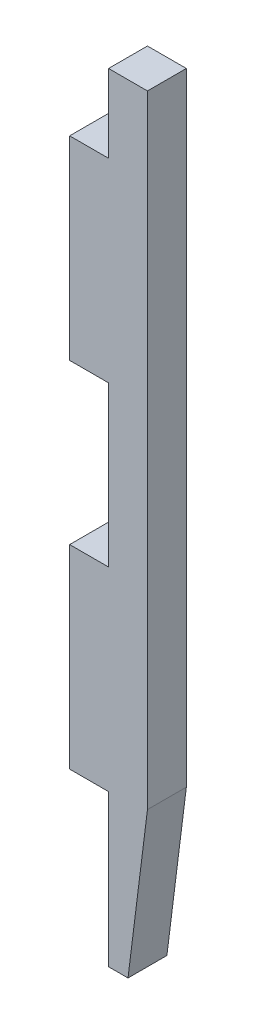
ISO-10303-21;
HEADER;
FILE_DESCRIPTION(('STEP AP214'),'2;1');
FILE_NAME('part.step','',(''),(''),'','','');
FILE_SCHEMA(('AUTOMOTIVE_DESIGN { 1 0 10303 214 1 1 1 1 }'));
ENDSEC;
DATA;
#1=APPLICATION_CONTEXT('core data for automotive mechanical design processes');
#2=APPLICATION_PROTOCOL_DEFINITION('international standard','automotive_design',2000,#1);
#3=PRODUCT_CONTEXT('',#1,'mechanical');
#4=PRODUCT('Part','Part','',(#3));
#5=PRODUCT_RELATED_PRODUCT_CATEGORY('part','',(#4));
#6=PRODUCT_DEFINITION_FORMATION('','',#4);
#7=PRODUCT_DEFINITION_CONTEXT('part definition',#1,'design');
#8=PRODUCT_DEFINITION('design','',#6,#7);
#9=PRODUCT_DEFINITION_SHAPE('','',#8);
#10=(LENGTH_UNIT() NAMED_UNIT(*) SI_UNIT(.MILLI.,.METRE.));
#11=(NAMED_UNIT(*) PLANE_ANGLE_UNIT() SI_UNIT($,.RADIAN.));
#12=(NAMED_UNIT(*) SI_UNIT($,.STERADIAN.) SOLID_ANGLE_UNIT());
#13=UNCERTAINTY_MEASURE_WITH_UNIT(LENGTH_MEASURE(1.E-05),#10,'distance_accuracy_value','');
#14=(GEOMETRIC_REPRESENTATION_CONTEXT(3) GLOBAL_UNCERTAINTY_ASSIGNED_CONTEXT((#13)) GLOBAL_UNIT_ASSIGNED_CONTEXT((#10,
#11,#12)) REPRESENTATION_CONTEXT('',''));
#15=CARTESIAN_POINT('',(0.,0.,0.));
#16=DIRECTION('',(0.,0.,1.));
#17=DIRECTION('',(1.,0.,0.));
#18=AXIS2_PLACEMENT_3D('',#15,#16,#17);
#19=CARTESIAN_POINT('',(0.,19.5,-5.));
#20=DIRECTION('',(1.,0.,0.));
#21=DIRECTION('',(0.,0.,1.));
#22=AXIS2_PLACEMENT_3D('',#19,#20,#21);
#23=PLANE('',#22);
#24=DIRECTION('',(0.,-1.,0.));
#25=VECTOR('',#24,1.);
#26=CARTESIAN_POINT('',(0.,19.5,0.));
#27=LINE('',#26,#25);
#28=CARTESIAN_POINT('',(0.,19.5,0.));
#29=VERTEX_POINT('',#28);
#30=CARTESIAN_POINT('',(0.,0.,0.));
#31=VERTEX_POINT('',#30);
#32=EDGE_CURVE('E161',#29,#31,#27,.T.);
#33=ORIENTED_EDGE('',*,*,#32,.F.);
#34=DIRECTION('',(0.,0.,1.));
#35=VECTOR('',#34,1.);
#36=CARTESIAN_POINT('',(0.,19.5,-5.));
#37=LINE('',#36,#35);
#38=CARTESIAN_POINT('',(0.,19.5,-5.));
#39=VERTEX_POINT('',#38);
#40=EDGE_CURVE('E160',#39,#29,#37,.T.);
#41=ORIENTED_EDGE('',*,*,#40,.F.);
#42=DIRECTION('',(0.,-1.,0.));
#43=VECTOR('',#42,1.);
#44=CARTESIAN_POINT('',(0.,19.5,-5.));
#45=LINE('',#44,#43);
#46=CARTESIAN_POINT('',(0.,0.,-5.));
#47=VERTEX_POINT('',#46);
#48=EDGE_CURVE('E194',#39,#47,#45,.T.);
#49=ORIENTED_EDGE('',*,*,#48,.T.);
#50=DIRECTION('',(0.,0.,1.));
#51=VECTOR('',#50,1.);
#52=CARTESIAN_POINT('',(0.,0.,-5.));
#53=LINE('',#52,#51);
#54=EDGE_CURVE('E11',#47,#31,#53,.T.);
#55=ORIENTED_EDGE('',*,*,#54,.T.);
#56=EDGE_LOOP('',(#33,#41,#49,#55));
#57=FACE_BOUND('',#56,.T.);
#58=ADVANCED_FACE('F35',(#57),#23,.F.);
#59=CARTESIAN_POINT('',(0.,0.,-5.));
#60=DIRECTION('',(0.,1.,0.));
#61=DIRECTION('',(0.,0.,-1.));
#62=AXIS2_PLACEMENT_3D('',#59,#60,#61);
#63=PLANE('',#62);
#64=DIRECTION('',(1.,0.,0.));
#65=VECTOR('',#64,1.);
#66=CARTESIAN_POINT('',(0.,0.,0.));
#67=LINE('',#66,#65);
#68=CARTESIAN_POINT('',(2.5,0.,0.));
#69=VERTEX_POINT('',#68);
#70=EDGE_CURVE('E163',#31,#69,#67,.T.);
#71=ORIENTED_EDGE('',*,*,#70,.F.);
#72=ORIENTED_EDGE('',*,*,#54,.F.);
#73=DIRECTION('',(1.,0.,0.));
#74=VECTOR('',#73,1.);
#75=CARTESIAN_POINT('',(0.,0.,-5.));
#76=LINE('',#75,#74);
#77=CARTESIAN_POINT('',(2.5,0.,-5.));
#78=VERTEX_POINT('',#77);
#79=EDGE_CURVE('E104',#47,#78,#76,.T.);
#80=ORIENTED_EDGE('',*,*,#79,.T.);
#81=DIRECTION('',(0.,0.,1.));
#82=VECTOR('',#81,1.);
#83=CARTESIAN_POINT('',(2.5,0.,-5.));
#84=LINE('',#83,#82);
#85=EDGE_CURVE('E43',#78,#69,#84,.T.);
#86=ORIENTED_EDGE('',*,*,#85,.T.);
#87=EDGE_LOOP('',(#71,#72,#80,#86));
#88=FACE_BOUND('',#87,.T.);
#89=ADVANCED_FACE('F221',(#88),#63,.F.);
#90=CARTESIAN_POINT('',(2.5,0.,-5.));
#91=DIRECTION('',(-0.992277876713668,0.124034734589208,0.));
#92=DIRECTION('',(-0.124034734589208,-0.992277876713668,0.));
#93=AXIS2_PLACEMENT_3D('',#90,#91,#92);
#94=PLANE('',#93);
#95=DIRECTION('',(0.124034734589208,0.992277876713668,0.));
#96=VECTOR('',#95,1.);
#97=CARTESIAN_POINT('',(2.5,0.,0.));
#98=LINE('',#97,#96);
#99=CARTESIAN_POINT('',(5.,20.,0.));
#100=VERTEX_POINT('',#99);
#101=EDGE_CURVE('E166',#69,#100,#98,.T.);
#102=ORIENTED_EDGE('',*,*,#101,.F.);
#103=ORIENTED_EDGE('',*,*,#85,.F.);
#104=DIRECTION('',(0.124034734589208,0.992277876713668,0.));
#105=VECTOR('',#104,1.);
#106=CARTESIAN_POINT('',(2.5,0.,-5.));
#107=LINE('',#106,#105);
#108=CARTESIAN_POINT('',(5.,20.,-5.));
#109=VERTEX_POINT('',#108);
#110=EDGE_CURVE('E230',#78,#109,#107,.T.);
#111=ORIENTED_EDGE('',*,*,#110,.T.);
#112=DIRECTION('',(0.,0.,1.));
#113=VECTOR('',#112,1.);
#114=CARTESIAN_POINT('',(5.,20.,-5.));
#115=LINE('',#114,#113);
#116=EDGE_CURVE('E216',#109,#100,#115,.T.);
#117=ORIENTED_EDGE('',*,*,#116,.T.);
#118=EDGE_LOOP('',(#102,#103,#111,#117));
#119=FACE_BOUND('',#118,.T.);
#120=ADVANCED_FACE('F270',(#119),#94,.F.);
#121=CARTESIAN_POINT('',(5.,20.,-5.));
#122=DIRECTION('',(-1.,0.,0.));
#123=DIRECTION('',(0.,0.,-1.));
#124=AXIS2_PLACEMENT_3D('',#121,#122,#123);
#125=PLANE('',#124);
#126=DIRECTION('',(0.,1.,0.));
#127=VECTOR('',#126,1.);
#128=CARTESIAN_POINT('',(5.,20.,0.));
#129=LINE('',#128,#127);
#130=CARTESIAN_POINT('',(5.,100.,0.));
#131=VERTEX_POINT('',#130);
#132=EDGE_CURVE('E169',#100,#131,#129,.T.);
#133=ORIENTED_EDGE('',*,*,#132,.F.);
#134=ORIENTED_EDGE('',*,*,#116,.F.);
#135=DIRECTION('',(0.,1.,0.));
#136=VECTOR('',#135,1.);
#137=CARTESIAN_POINT('',(5.,20.,-5.));
#138=LINE('',#137,#136);
#139=CARTESIAN_POINT('',(5.,100.,-5.));
#140=VERTEX_POINT('',#139);
#141=EDGE_CURVE('E234',#109,#140,#138,.T.);
#142=ORIENTED_EDGE('',*,*,#141,.T.);
#143=DIRECTION('',(0.,0.,1.));
#144=VECTOR('',#143,1.);
#145=CARTESIAN_POINT('',(5.,100.,-5.));
#146=LINE('',#145,#144);
#147=EDGE_CURVE('E213',#140,#131,#146,.T.);
#148=ORIENTED_EDGE('',*,*,#147,.T.);
#149=EDGE_LOOP('',(#133,#134,#142,#148));
#150=FACE_BOUND('',#149,.T.);
#151=ADVANCED_FACE('F269',(#150),#125,.F.);
#152=CARTESIAN_POINT('',(5.,100.,-5.));
#153=DIRECTION('',(0.,-1.,0.));
#154=DIRECTION('',(0.,0.,1.));
#155=AXIS2_PLACEMENT_3D('',#152,#153,#154);
#156=PLANE('',#155);
#157=DIRECTION('',(-1.,0.,0.));
#158=VECTOR('',#157,1.);
#159=CARTESIAN_POINT('',(5.,100.,0.));
#160=LINE('',#159,#158);
#161=CARTESIAN_POINT('',(0.,100.,0.));
#162=VERTEX_POINT('',#161);
#163=EDGE_CURVE('E172',#131,#162,#160,.T.);
#164=ORIENTED_EDGE('',*,*,#163,.F.);
#165=ORIENTED_EDGE('',*,*,#147,.F.);
#166=DIRECTION('',(-1.,0.,0.));
#167=VECTOR('',#166,1.);
#168=CARTESIAN_POINT('',(5.,100.,-5.));
#169=LINE('',#168,#167);
#170=CARTESIAN_POINT('',(0.,100.,-5.));
#171=VERTEX_POINT('',#170);
#172=EDGE_CURVE('E237',#140,#171,#169,.T.);
#173=ORIENTED_EDGE('',*,*,#172,.T.);
#174=DIRECTION('',(0.,0.,1.));
#175=VECTOR('',#174,1.);
#176=CARTESIAN_POINT('',(0.,100.,-5.));
#177=LINE('',#176,#175);
#178=EDGE_CURVE('E210',#171,#162,#177,.T.);
#179=ORIENTED_EDGE('',*,*,#178,.T.);
#180=EDGE_LOOP('',(#164,#165,#173,#179));
#181=FACE_BOUND('',#180,.T.);
#182=ADVANCED_FACE('F266',(#181),#156,.F.);
#183=CARTESIAN_POINT('',(0.,100.,-5.));
#184=DIRECTION('',(1.,0.,0.));
#185=DIRECTION('',(0.,1.,0.));
#186=AXIS2_PLACEMENT_3D('',#183,#184,#185);
#187=PLANE('',#186);
#188=DIRECTION('',(0.,-1.,0.));
#189=VECTOR('',#188,1.);
#190=CARTESIAN_POINT('',(0.,100.,0.));
#191=LINE('',#190,#189);
#192=CARTESIAN_POINT('',(0.,90.,0.));
#193=VERTEX_POINT('',#192);
#194=EDGE_CURVE('E175',#162,#193,#191,.T.);
#195=ORIENTED_EDGE('',*,*,#194,.F.);
#196=ORIENTED_EDGE('',*,*,#178,.F.);
#197=DIRECTION('',(0.,-1.,0.));
#198=VECTOR('',#197,1.);
#199=CARTESIAN_POINT('',(0.,100.,-5.));
#200=LINE('',#199,#198);
#201=CARTESIAN_POINT('',(0.,90.,-5.));
#202=VERTEX_POINT('',#201);
#203=EDGE_CURVE('E240',#171,#202,#200,.T.);
#204=ORIENTED_EDGE('',*,*,#203,.T.);
#205=DIRECTION('',(0.,0.,1.));
#206=VECTOR('',#205,1.);
#207=CARTESIAN_POINT('',(0.,90.,-5.));
#208=LINE('',#207,#206);
#209=EDGE_CURVE('E207',#202,#193,#208,.T.);
#210=ORIENTED_EDGE('',*,*,#209,.T.);
#211=EDGE_LOOP('',(#195,#196,#204,#210));
#212=FACE_BOUND('',#211,.T.);
#213=ADVANCED_FACE('F264',(#212),#187,.F.);
#214=CARTESIAN_POINT('',(0.,90.,-5.));
#215=DIRECTION('',(0.,-1.,0.));
#216=DIRECTION('',(1.,0.,0.));
#217=AXIS2_PLACEMENT_3D('',#214,#215,#216);
#218=PLANE('',#217);
#219=DIRECTION('',(-1.,0.,0.));
#220=VECTOR('',#219,1.);
#221=CARTESIAN_POINT('',(0.,90.,0.));
#222=LINE('',#221,#220);
#223=CARTESIAN_POINT('',(-5.,90.,0.));
#224=VERTEX_POINT('',#223);
#225=EDGE_CURVE('E178',#193,#224,#222,.T.);
#226=ORIENTED_EDGE('',*,*,#225,.F.);
#227=ORIENTED_EDGE('',*,*,#209,.F.);
#228=DIRECTION('',(-1.,0.,0.));
#229=VECTOR('',#228,1.);
#230=CARTESIAN_POINT('',(0.,90.,-5.));
#231=LINE('',#230,#229);
#232=CARTESIAN_POINT('',(-5.,90.,-5.));
#233=VERTEX_POINT('',#232);
#234=EDGE_CURVE('E243',#202,#233,#231,.T.);
#235=ORIENTED_EDGE('',*,*,#234,.T.);
#236=DIRECTION('',(0.,0.,1.));
#237=VECTOR('',#236,1.);
#238=CARTESIAN_POINT('',(-5.,90.,-5.));
#239=LINE('',#238,#237);
#240=EDGE_CURVE('E204',#233,#224,#239,.T.);
#241=ORIENTED_EDGE('',*,*,#240,.T.);
#242=EDGE_LOOP('',(#226,#227,#235,#241));
#243=FACE_BOUND('',#242,.T.);
#244=ADVANCED_FACE('F260',(#243),#218,.F.);
#245=CARTESIAN_POINT('',(-5.,90.,-5.));
#246=DIRECTION('',(1.,0.,0.));
#247=DIRECTION('',(0.,1.,0.));
#248=AXIS2_PLACEMENT_3D('',#245,#246,#247);
#249=PLANE('',#248);
#250=DIRECTION('',(0.,-1.,0.));
#251=VECTOR('',#250,1.);
#252=CARTESIAN_POINT('',(-5.,90.,0.));
#253=LINE('',#252,#251);
#254=CARTESIAN_POINT('',(-4.99999999999999,65.,0.));
#255=VERTEX_POINT('',#254);
#256=EDGE_CURVE('E181',#224,#255,#253,.T.);
#257=ORIENTED_EDGE('',*,*,#256,.F.);
#258=ORIENTED_EDGE('',*,*,#240,.F.);
#259=DIRECTION('',(0.,-1.,0.));
#260=VECTOR('',#259,1.);
#261=CARTESIAN_POINT('',(-5.,90.,-5.));
#262=LINE('',#261,#260);
#263=CARTESIAN_POINT('',(-4.99999999999999,65.,-5.));
#264=VERTEX_POINT('',#263);
#265=EDGE_CURVE('E246',#233,#264,#262,.T.);
#266=ORIENTED_EDGE('',*,*,#265,.T.);
#267=DIRECTION('',(0.,0.,1.));
#268=VECTOR('',#267,1.);
#269=CARTESIAN_POINT('',(-4.99999999999999,65.,-5.));
#270=LINE('',#269,#268);
#271=EDGE_CURVE('E201',#264,#255,#270,.T.);
#272=ORIENTED_EDGE('',*,*,#271,.T.);
#273=EDGE_LOOP('',(#257,#258,#266,#272));
#274=FACE_BOUND('',#273,.T.);
#275=ADVANCED_FACE('F257',(#274),#249,.F.);
#276=CARTESIAN_POINT('',(-4.99999999999999,65.,-5.));
#277=DIRECTION('',(0.,1.,0.));
#278=DIRECTION('',(0.,0.,-1.));
#279=AXIS2_PLACEMENT_3D('',#276,#277,#278);
#280=PLANE('',#279);
#281=DIRECTION('',(1.,0.,0.));
#282=VECTOR('',#281,1.);
#283=CARTESIAN_POINT('',(-4.99999999999999,65.,0.));
#284=LINE('',#283,#282);
#285=CARTESIAN_POINT('',(0.,65.,0.));
#286=VERTEX_POINT('',#285);
#287=EDGE_CURVE('E184',#255,#286,#284,.T.);
#288=ORIENTED_EDGE('',*,*,#287,.F.);
#289=ORIENTED_EDGE('',*,*,#271,.F.);
#290=DIRECTION('',(1.,0.,0.));
#291=VECTOR('',#290,1.);
#292=CARTESIAN_POINT('',(-4.99999999999999,65.,-5.));
#293=LINE('',#292,#291);
#294=CARTESIAN_POINT('',(0.,65.,-5.));
#295=VERTEX_POINT('',#294);
#296=EDGE_CURVE('E155',#264,#295,#293,.T.);
#297=ORIENTED_EDGE('',*,*,#296,.T.);
#298=DIRECTION('',(0.,0.,1.));
#299=VECTOR('',#298,1.);
#300=CARTESIAN_POINT('',(0.,65.,-5.));
#301=LINE('',#300,#299);
#302=EDGE_CURVE('E198',#295,#286,#301,.T.);
#303=ORIENTED_EDGE('',*,*,#302,.T.);
#304=EDGE_LOOP('',(#288,#289,#297,#303));
#305=FACE_BOUND('',#304,.T.);
#306=ADVANCED_FACE('F251',(#305),#280,.F.);
#307=CARTESIAN_POINT('',(0.,65.,-5.));
#308=DIRECTION('',(1.,0.,0.));
#309=DIRECTION('',(0.,1.,0.));
#310=AXIS2_PLACEMENT_3D('',#307,#308,#309);
#311=PLANE('',#310);
#312=DIRECTION('',(0.,-1.,0.));
#313=VECTOR('',#312,1.);
#314=CARTESIAN_POINT('',(0.,65.,0.));
#315=LINE('',#314,#313);
#316=CARTESIAN_POINT('',(0.,44.5,0.));
#317=VERTEX_POINT('',#316);
#318=EDGE_CURVE('E187',#286,#317,#315,.T.);
#319=ORIENTED_EDGE('',*,*,#318,.F.);
#320=ORIENTED_EDGE('',*,*,#302,.F.);
#321=DIRECTION('',(0.,-1.,0.));
#322=VECTOR('',#321,1.);
#323=CARTESIAN_POINT('',(0.,65.,-5.));
#324=LINE('',#323,#322);
#325=CARTESIAN_POINT('',(0.,44.5,-5.));
#326=VERTEX_POINT('',#325);
#327=EDGE_CURVE('E153',#295,#326,#324,.T.);
#328=ORIENTED_EDGE('',*,*,#327,.T.);
#329=DIRECTION('',(0.,0.,1.));
#330=VECTOR('',#329,1.);
#331=CARTESIAN_POINT('',(0.,44.5,-5.));
#332=LINE('',#331,#330);
#333=EDGE_CURVE('E147',#326,#317,#332,.T.);
#334=ORIENTED_EDGE('',*,*,#333,.T.);
#335=EDGE_LOOP('',(#319,#320,#328,#334));
#336=FACE_BOUND('',#335,.T.);
#337=ADVANCED_FACE('F255',(#336),#311,.F.);
#338=CARTESIAN_POINT('',(0.,44.5,-5.));
#339=DIRECTION('',(0.,-1.,0.));
#340=DIRECTION('',(0.,0.,1.));
#341=AXIS2_PLACEMENT_3D('',#338,#339,#340);
#342=PLANE('',#341);
#343=DIRECTION('',(-1.,0.,0.));
#344=VECTOR('',#343,1.);
#345=CARTESIAN_POINT('',(0.,44.5,0.));
#346=LINE('',#345,#344);
#347=CARTESIAN_POINT('',(-5.,44.5,0.));
#348=VERTEX_POINT('',#347);
#349=EDGE_CURVE('E190',#317,#348,#346,.T.);
#350=ORIENTED_EDGE('',*,*,#349,.F.);
#351=ORIENTED_EDGE('',*,*,#333,.F.);
#352=DIRECTION('',(-1.,0.,0.));
#353=VECTOR('',#352,1.);
#354=CARTESIAN_POINT('',(0.,44.5,-5.));
#355=LINE('',#354,#353);
#356=CARTESIAN_POINT('',(-5.,44.5,-5.));
#357=VERTEX_POINT('',#356);
#358=EDGE_CURVE('E137',#326,#357,#355,.T.);
#359=ORIENTED_EDGE('',*,*,#358,.T.);
#360=DIRECTION('',(0.,0.,1.));
#361=VECTOR('',#360,1.);
#362=CARTESIAN_POINT('',(-5.,44.5,-5.));
#363=LINE('',#362,#361);
#364=EDGE_CURVE('E142',#357,#348,#363,.T.);
#365=ORIENTED_EDGE('',*,*,#364,.T.);
#366=EDGE_LOOP('',(#350,#351,#359,#365));
#367=FACE_BOUND('',#366,.T.);
#368=ADVANCED_FACE('F150',(#367),#342,.F.);
#369=CARTESIAN_POINT('',(-5.,44.5,-5.));
#370=DIRECTION('',(1.,0.,0.));
#371=DIRECTION('',(0.,1.,0.));
#372=AXIS2_PLACEMENT_3D('',#369,#370,#371);
#373=PLANE('',#372);
#374=DIRECTION('',(0.,-1.,0.));
#375=VECTOR('',#374,1.);
#376=CARTESIAN_POINT('',(-5.,44.5,0.));
#377=LINE('',#376,#375);
#378=CARTESIAN_POINT('',(-5.,19.5,0.));
#379=VERTEX_POINT('',#378);
#380=EDGE_CURVE('E144',#348,#379,#377,.T.);
#381=ORIENTED_EDGE('',*,*,#380,.F.);
#382=ORIENTED_EDGE('',*,*,#364,.F.);
#383=DIRECTION('',(0.,-1.,0.));
#384=VECTOR('',#383,1.);
#385=CARTESIAN_POINT('',(-5.,44.5,-5.));
#386=LINE('',#385,#384);
#387=CARTESIAN_POINT('',(-5.,19.5,-5.));
#388=VERTEX_POINT('',#387);
#389=EDGE_CURVE('E133',#357,#388,#386,.T.);
#390=ORIENTED_EDGE('',*,*,#389,.T.);
#391=DIRECTION('',(0.,0.,1.));
#392=VECTOR('',#391,1.);
#393=CARTESIAN_POINT('',(-5.,19.5,-5.));
#394=LINE('',#393,#392);
#395=EDGE_CURVE('E148',#388,#379,#394,.T.);
#396=ORIENTED_EDGE('',*,*,#395,.T.);
#397=EDGE_LOOP('',(#381,#382,#390,#396));
#398=FACE_BOUND('',#397,.T.);
#399=ADVANCED_FACE('F143',(#398),#373,.F.);
#400=CARTESIAN_POINT('',(-5.,19.5,-5.));
#401=DIRECTION('',(0.,1.,0.));
#402=DIRECTION('',(0.,0.,-1.));
#403=AXIS2_PLACEMENT_3D('',#400,#401,#402);
#404=PLANE('',#403);
#405=DIRECTION('',(1.,0.,0.));
#406=VECTOR('',#405,1.);
#407=CARTESIAN_POINT('',(-5.,19.5,0.));
#408=LINE('',#407,#406);
#409=EDGE_CURVE('E92',#379,#29,#408,.T.);
#410=ORIENTED_EDGE('',*,*,#409,.F.);
#411=ORIENTED_EDGE('',*,*,#395,.F.);
#412=DIRECTION('',(1.,0.,0.));
#413=VECTOR('',#412,1.);
#414=CARTESIAN_POINT('',(-5.,19.5,-5.));
#415=LINE('',#414,#413);
#416=EDGE_CURVE('E51',#388,#39,#415,.T.);
#417=ORIENTED_EDGE('',*,*,#416,.T.);
#418=ORIENTED_EDGE('',*,*,#40,.T.);
#419=EDGE_LOOP('',(#410,#411,#417,#418));
#420=FACE_BOUND('',#419,.T.);
#421=ADVANCED_FACE('F360',(#420),#404,.F.);
#422=CARTESIAN_POINT('',(0.,0.,-5.));
#423=DIRECTION('',(0.,0.,-1.));
#424=DIRECTION('',(1.,0.,0.));
#425=AXIS2_PLACEMENT_3D('',#422,#423,#424);
#426=PLANE('',#425);
#427=ORIENTED_EDGE('',*,*,#48,.F.);
#428=ORIENTED_EDGE('',*,*,#416,.F.);
#429=ORIENTED_EDGE('',*,*,#389,.F.);
#430=ORIENTED_EDGE('',*,*,#358,.F.);
#431=ORIENTED_EDGE('',*,*,#327,.F.);
#432=ORIENTED_EDGE('',*,*,#296,.F.);
#433=ORIENTED_EDGE('',*,*,#265,.F.);
#434=ORIENTED_EDGE('',*,*,#234,.F.);
#435=ORIENTED_EDGE('',*,*,#203,.F.);
#436=ORIENTED_EDGE('',*,*,#172,.F.);
#437=ORIENTED_EDGE('',*,*,#141,.F.);
#438=ORIENTED_EDGE('',*,*,#110,.F.);
#439=ORIENTED_EDGE('',*,*,#79,.F.);
#440=EDGE_LOOP('',(#427,#428,#429,#430,#431,#432,#433,#434,#435,#436,#437,#438,#439));
#441=FACE_BOUND('',#440,.T.);
#442=ADVANCED_FACE('F135',(#441),#426,.T.);
#443=CARTESIAN_POINT('',(0.,0.,0.));
#444=DIRECTION('',(0.,0.,-1.));
#445=DIRECTION('',(1.,0.,0.));
#446=AXIS2_PLACEMENT_3D('',#443,#444,#445);
#447=PLANE('',#446);
#448=ORIENTED_EDGE('',*,*,#32,.T.);
#449=ORIENTED_EDGE('',*,*,#70,.T.);
#450=ORIENTED_EDGE('',*,*,#101,.T.);
#451=ORIENTED_EDGE('',*,*,#132,.T.);
#452=ORIENTED_EDGE('',*,*,#163,.T.);
#453=ORIENTED_EDGE('',*,*,#194,.T.);
#454=ORIENTED_EDGE('',*,*,#225,.T.);
#455=ORIENTED_EDGE('',*,*,#256,.T.);
#456=ORIENTED_EDGE('',*,*,#287,.T.);
#457=ORIENTED_EDGE('',*,*,#318,.T.);
#458=ORIENTED_EDGE('',*,*,#349,.T.);
#459=ORIENTED_EDGE('',*,*,#380,.T.);
#460=ORIENTED_EDGE('',*,*,#409,.T.);
#461=EDGE_LOOP('',(#448,#449,#450,#451,#452,#453,#454,#455,#456,#457,#458,#459,#460));
#462=FACE_BOUND('',#461,.T.);
#463=ADVANCED_FACE('F224',(#462),#447,.F.);
#464=CLOSED_SHELL('',(#58,#89,#120,#151,#182,#213,#244,#275,#306,#337,#368,#399,#421,#442,#463));
#465=MANIFOLD_SOLID_BREP('B2',#464);
#466=ADVANCED_BREP_SHAPE_REPRESENTATION('',(#18,#465),#14);
#467=SHAPE_DEFINITION_REPRESENTATION(#9,#466);
ENDSEC;
END-ISO-10303-21;
